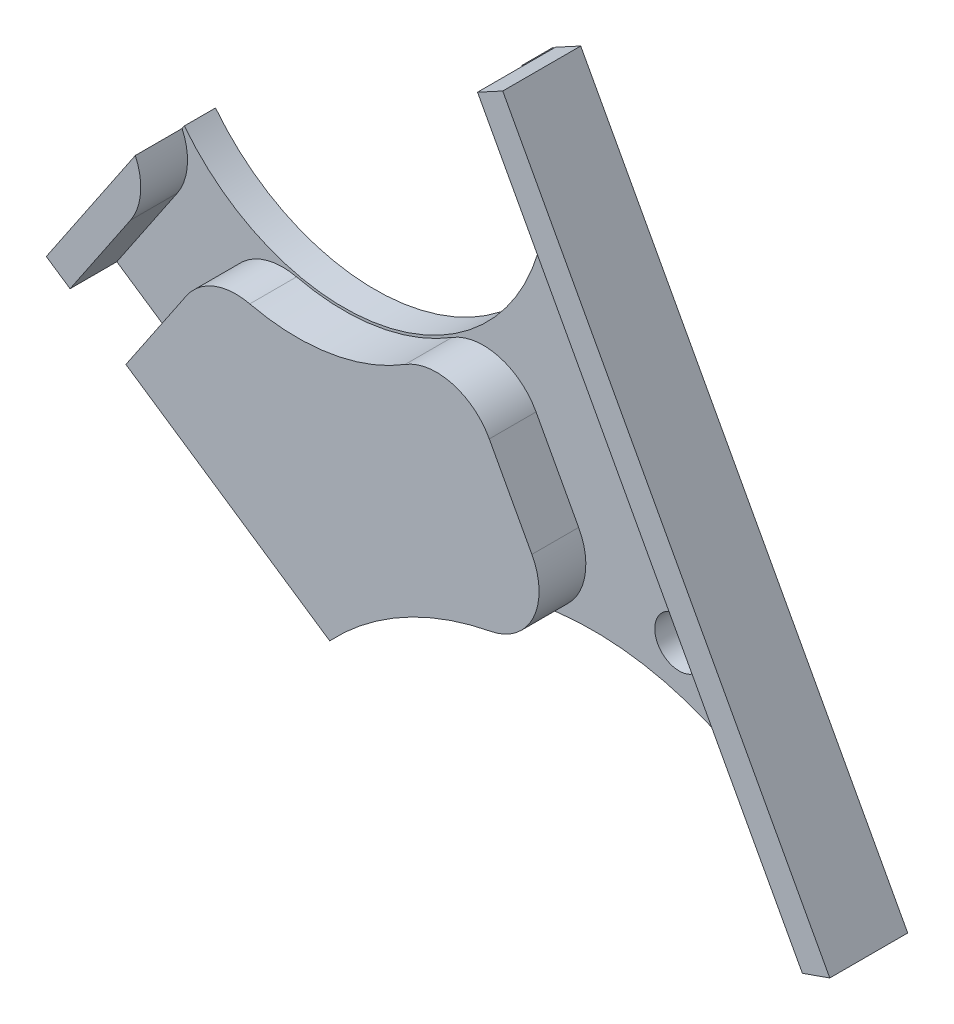
ISO-10303-21;
HEADER;
FILE_DESCRIPTION(('STEP AP214'),'2;1');
FILE_NAME('part.step','',(''),(''),'','','');
FILE_SCHEMA(('AUTOMOTIVE_DESIGN { 1 0 10303 214 1 1 1 1 }'));
ENDSEC;
DATA;
#1=APPLICATION_CONTEXT('core data for automotive mechanical design processes');
#2=APPLICATION_PROTOCOL_DEFINITION('international standard','automotive_design',2000,#1);
#3=PRODUCT_CONTEXT('',#1,'mechanical');
#4=PRODUCT('Part','Part','',(#3));
#5=PRODUCT_RELATED_PRODUCT_CATEGORY('part','',(#4));
#6=PRODUCT_DEFINITION_FORMATION('','',#4);
#7=PRODUCT_DEFINITION_CONTEXT('part definition',#1,'design');
#8=PRODUCT_DEFINITION('design','',#6,#7);
#9=PRODUCT_DEFINITION_SHAPE('','',#8);
#10=(LENGTH_UNIT() NAMED_UNIT(*) SI_UNIT(.MILLI.,.METRE.));
#11=(NAMED_UNIT(*) PLANE_ANGLE_UNIT() SI_UNIT($,.RADIAN.));
#12=(NAMED_UNIT(*) SI_UNIT($,.STERADIAN.) SOLID_ANGLE_UNIT());
#13=UNCERTAINTY_MEASURE_WITH_UNIT(LENGTH_MEASURE(1.E-05),#10,'distance_accuracy_value','');
#14=(GEOMETRIC_REPRESENTATION_CONTEXT(3) GLOBAL_UNCERTAINTY_ASSIGNED_CONTEXT((#13)) GLOBAL_UNIT_ASSIGNED_CONTEXT((#10,
#11,#12)) REPRESENTATION_CONTEXT('',''));
#15=CARTESIAN_POINT('',(0.,0.,0.));
#16=DIRECTION('',(0.,0.,1.));
#17=DIRECTION('',(1.,0.,0.));
#18=AXIS2_PLACEMENT_3D('',#15,#16,#17);
#19=CARTESIAN_POINT('',(592.825113660689,443.6785419672,1.5875));
#20=DIRECTION('',(0.,0.,-1.));
#21=DIRECTION('',(-1.,0.,0.));
#22=AXIS2_PLACEMENT_3D('',#19,#20,#21);
#23=CYLINDRICAL_SURFACE('',#22,20.6375);
#24=CARTESIAN_POINT('',(592.825113660689,443.6785419672,-1.5875));
#25=DIRECTION('',(0.,0.,1.));
#26=DIRECTION('',(1.,0.,0.));
#27=AXIS2_PLACEMENT_3D('',#24,#25,#26);
#28=CIRCLE('',#27,20.6375);
#29=CARTESIAN_POINT('',(576.580250753386,430.950194259311,-1.5875));
#30=VERTEX_POINT('',#29);
#31=CARTESIAN_POINT('',(610.977682891891,453.496415288669,-1.5875));
#32=VERTEX_POINT('',#31);
#33=EDGE_CURVE('E380',#30,#32,#28,.T.);
#34=ORIENTED_EDGE('',*,*,#33,.F.);
#35=DIRECTION('',(0.,0.,-1.));
#36=VECTOR('',#35,1.);
#37=CARTESIAN_POINT('',(576.580250753386,430.950194259311,1.5875));
#38=LINE('',#37,#36);
#39=CARTESIAN_POINT('',(576.580250753386,430.950194259311,1.5875));
#40=VERTEX_POINT('',#39);
#41=EDGE_CURVE('E467',#40,#30,#38,.T.);
#42=ORIENTED_EDGE('',*,*,#41,.F.);
#43=CARTESIAN_POINT('',(592.825113660689,443.6785419672,1.5875));
#44=DIRECTION('',(0.,0.,1.));
#45=DIRECTION('',(1.,0.,0.));
#46=AXIS2_PLACEMENT_3D('',#43,#44,#45);
#47=CIRCLE('',#46,20.6375);
#48=CARTESIAN_POINT('',(610.977682891891,453.496415288669,1.5875));
#49=VERTEX_POINT('',#48);
#50=EDGE_CURVE('E381',#40,#49,#47,.T.);
#51=ORIENTED_EDGE('',*,*,#50,.T.);
#52=DIRECTION('',(0.,0.,-1.));
#53=VECTOR('',#52,1.);
#54=CARTESIAN_POINT('',(610.977682891891,453.496415288669,1.5875));
#55=LINE('',#54,#53);
#56=EDGE_CURVE('E136',#49,#32,#55,.T.);
#57=ORIENTED_EDGE('',*,*,#56,.T.);
#58=EDGE_LOOP('',(#34,#42,#51,#57));
#59=FACE_BOUND('',#58,.T.);
#60=ADVANCED_FACE('F119',(#59),#23,.F.);
#61=CARTESIAN_POINT('',(196.500476039685,-132.541244652355,1.5875));
#62=DIRECTION('',(-0.82903757255505,0.559192903470735,0.));
#63=DIRECTION('',(-0.559192903470735,-0.82903757255505,0.));
#64=AXIS2_PLACEMENT_3D('',#61,#62,#63);
#65=PLANE('',#64);
#66=DIRECTION('',(0.,0.,-1.));
#67=VECTOR('',#66,1.);
#68=CARTESIAN_POINT('',(576.350679015296,430.609840160944,6.35));
#69=LINE('',#68,#67);
#70=CARTESIAN_POINT('',(576.350679015296,430.609840160944,6.35));
#71=VERTEX_POINT('',#70);
#72=CARTESIAN_POINT('',(576.350679015296,430.609840160944,1.5875));
#73=VERTEX_POINT('',#72);
#74=EDGE_CURVE('E318',#71,#73,#69,.T.);
#75=ORIENTED_EDGE('',*,*,#74,.T.);
#76=DIRECTION('',(0.559192903470735,0.82903757255505,0.));
#77=VECTOR('',#76,1.);
#78=CARTESIAN_POINT('',(196.500476039685,-132.541244652355,1.5875));
#79=LINE('',#78,#77);
#80=EDGE_CURVE('E177',#73,#40,#79,.T.);
#81=ORIENTED_EDGE('',*,*,#80,.T.);
#82=ORIENTED_EDGE('',*,*,#41,.T.);
#83=DIRECTION('',(0.559192903470735,0.82903757255505,0.));
#84=VECTOR('',#83,1.);
#85=CARTESIAN_POINT('',(196.500476039685,-132.541244652355,-1.5875));
#86=LINE('',#85,#84);
#87=CARTESIAN_POINT('',(567.283779016713,417.167608117638,-1.5875));
#88=VERTEX_POINT('',#87);
#89=EDGE_CURVE('E411',#88,#30,#86,.T.);
#90=ORIENTED_EDGE('',*,*,#89,.F.);
#91=DIRECTION('',(0.,0.,-1.));
#92=VECTOR('',#91,1.);
#93=CARTESIAN_POINT('',(567.283779016713,417.167608117638,1.5875));
#94=LINE('',#93,#92);
#95=CARTESIAN_POINT('',(567.283779016713,417.167608117638,6.35));
#96=VERTEX_POINT('',#95);
#97=EDGE_CURVE('E464',#96,#88,#94,.T.);
#98=ORIENTED_EDGE('',*,*,#97,.F.);
#99=DIRECTION('',(0.559192903470735,0.82903757255505,0.));
#100=VECTOR('',#99,1.);
#101=CARTESIAN_POINT('',(196.500476039685,-132.541244652355,6.35));
#102=LINE('',#101,#100);
#103=EDGE_CURVE('E307',#96,#71,#102,.T.);
#104=ORIENTED_EDGE('',*,*,#103,.T.);
#105=EDGE_LOOP('',(#75,#81,#82,#90,#98,#104));
#106=FACE_BOUND('',#105,.T.);
#107=ADVANCED_FACE('F512',(#106),#65,.T.);
#108=CARTESIAN_POINT('',(370.783302977037,549.70885276999,1.5875));
#109=DIRECTION('',(-0.559192903470746,-0.829037572555042,0.));
#110=DIRECTION('',(0.829037572555042,-0.559192903470746,0.));
#111=AXIS2_PLACEMENT_3D('',#108,#109,#110);
#112=PLANE('',#111);
#113=DIRECTION('',(-0.829037572555042,0.559192903470746,0.));
#114=VECTOR('',#113,1.);
#115=CARTESIAN_POINT('',(370.783302977037,549.70885276999,1.5875));
#116=LINE('',#115,#114);
#117=CARTESIAN_POINT('',(575.390937438729,411.699260714598,1.5875));
#118=VERTEX_POINT('',#117);
#119=CARTESIAN_POINT('',(569.705397766147,415.5342056466,1.5875));
#120=VERTEX_POINT('',#119);
#121=EDGE_CURVE('E387',#118,#120,#116,.T.);
#122=ORIENTED_EDGE('',*,*,#121,.T.);
#123=DIRECTION('',(0.,0.,-1.));
#124=VECTOR('',#123,1.);
#125=CARTESIAN_POINT('',(569.705397766147,415.5342056466,6.35));
#126=LINE('',#125,#124);
#127=CARTESIAN_POINT('',(569.705397766147,415.5342056466,6.35));
#128=VERTEX_POINT('',#127);
#129=EDGE_CURVE('E315',#128,#120,#126,.T.);
#130=ORIENTED_EDGE('',*,*,#129,.F.);
#131=DIRECTION('',(-0.829037572555042,0.559192903470746,0.));
#132=VECTOR('',#131,1.);
#133=CARTESIAN_POINT('',(370.783302977037,549.70885276999,6.35));
#134=LINE('',#133,#132);
#135=EDGE_CURVE('E311',#128,#96,#134,.T.);
#136=ORIENTED_EDGE('',*,*,#135,.T.);
#137=ORIENTED_EDGE('',*,*,#97,.T.);
#138=DIRECTION('',(-0.829037572555042,0.559192903470746,0.));
#139=VECTOR('',#138,1.);
#140=CARTESIAN_POINT('',(370.783302977037,549.70885276999,-1.5875));
#141=LINE('',#140,#139);
#142=CARTESIAN_POINT('',(596.147549096024,397.698749370961,-1.5875));
#143=VERTEX_POINT('',#142);
#144=EDGE_CURVE('E415',#143,#88,#141,.T.);
#145=ORIENTED_EDGE('',*,*,#144,.F.);
#146=DIRECTION('',(0.,0.,-1.));
#147=VECTOR('',#146,1.);
#148=CARTESIAN_POINT('',(596.147549096024,397.698749370961,1.5875));
#149=LINE('',#148,#147);
#150=CARTESIAN_POINT('',(596.147549096024,397.698749370961,6.35));
#151=VERTEX_POINT('',#150);
#152=EDGE_CURVE('E461',#151,#143,#149,.T.);
#153=ORIENTED_EDGE('',*,*,#152,.F.);
#154=DIRECTION('',(-0.829037572555042,0.559192903470746,0.));
#155=VECTOR('',#154,1.);
#156=CARTESIAN_POINT('',(370.783302977037,549.70885276999,6.35));
#157=LINE('',#156,#155);
#158=CARTESIAN_POINT('',(575.390937438729,411.699260714598,6.35));
#159=VERTEX_POINT('',#158);
#160=EDGE_CURVE('E345',#151,#159,#157,.T.);
#161=ORIENTED_EDGE('',*,*,#160,.T.);
#162=DIRECTION('',(0.,0.,-1.));
#163=VECTOR('',#162,1.);
#164=CARTESIAN_POINT('',(575.390937438729,411.699260714598,6.35));
#165=LINE('',#164,#163);
#166=EDGE_CURVE('E356',#159,#118,#165,.T.);
#167=ORIENTED_EDGE('',*,*,#166,.T.);
#168=EDGE_LOOP('',(#122,#130,#136,#137,#145,#153,#161,#167));
#169=FACE_BOUND('',#168,.T.);
#170=ADVANCED_FACE('F520',(#169),#112,.T.);
#171=CARTESIAN_POINT('',(618.232675614043,377.021426060275,1.5875));
#172=DIRECTION('',(0.,0.,-1.));
#173=DIRECTION('',(-1.,0.,0.));
#174=AXIS2_PLACEMENT_3D('',#171,#172,#173);
#175=CYLINDRICAL_SURFACE('',#174,30.2539999440006);
#176=CARTESIAN_POINT('',(618.232675614043,377.021426060275,1.5875));
#177=DIRECTION('',(0.,0.,1.));
#178=DIRECTION('',(1.,0.,0.));
#179=AXIS2_PLACEMENT_3D('',#176,#177,#178);
#180=CIRCLE('',#179,30.2539999440006);
#181=CARTESIAN_POINT('',(644.263601134856,392.438800322498,1.5875));
#182=VERTEX_POINT('',#181);
#183=CARTESIAN_POINT('',(612.524795422006,406.732107915879,1.5875));
#184=VERTEX_POINT('',#183);
#185=EDGE_CURVE('E391',#182,#184,#180,.T.);
#186=ORIENTED_EDGE('',*,*,#185,.T.);
#187=DIRECTION('',(0.,0.,-1.));
#188=VECTOR('',#187,1.);
#189=CARTESIAN_POINT('',(612.524795422006,406.732107915879,6.35));
#190=LINE('',#189,#188);
#191=CARTESIAN_POINT('',(612.524795422006,406.732107915879,6.35));
#192=VERTEX_POINT('',#191);
#193=EDGE_CURVE('E353',#192,#184,#190,.T.);
#194=ORIENTED_EDGE('',*,*,#193,.F.);
#195=CARTESIAN_POINT('',(618.232675614043,377.021426060275,6.35));
#196=DIRECTION('',(0.,0.,1.));
#197=DIRECTION('',(1.,0.,0.));
#198=AXIS2_PLACEMENT_3D('',#195,#196,#197);
#199=CIRCLE('',#198,30.2539999440006);
#200=EDGE_CURVE('E349',#192,#151,#199,.T.);
#201=ORIENTED_EDGE('',*,*,#200,.T.);
#202=ORIENTED_EDGE('',*,*,#152,.T.);
#203=CARTESIAN_POINT('',(618.232675614043,377.021426060275,-1.5875));
#204=DIRECTION('',(0.,0.,1.));
#205=DIRECTION('',(1.,0.,0.));
#206=AXIS2_PLACEMENT_3D('',#203,#204,#205);
#207=CIRCLE('',#206,30.2539999440006);
#208=CARTESIAN_POINT('',(644.263601134856,392.438800322498,-1.5875));
#209=VERTEX_POINT('',#208);
#210=EDGE_CURVE('E419',#209,#143,#207,.T.);
#211=ORIENTED_EDGE('',*,*,#210,.F.);
#212=DIRECTION('',(0.,0.,-1.));
#213=VECTOR('',#212,1.);
#214=CARTESIAN_POINT('',(644.263601134856,392.438800322498,1.5875));
#215=LINE('',#214,#213);
#216=EDGE_CURVE('E458',#182,#209,#215,.T.);
#217=ORIENTED_EDGE('',*,*,#216,.F.);
#218=EDGE_LOOP('',(#186,#194,#201,#202,#211,#217));
#219=FACE_BOUND('',#218,.T.);
#220=ADVANCED_FACE('F542',(#219),#175,.F.);
#221=CARTESIAN_POINT('',(-51.8861243691058,147.418357522562,1.5875));
#222=DIRECTION('',(0.332001308771841,-0.943278925331094,0.));
#223=DIRECTION('',(0.943278925331095,0.332001308771841,0.));
#224=AXIS2_PLACEMENT_3D('',#221,#222,#223);
#225=PLANE('',#224);
#226=DIRECTION('',(0.,0.,-1.));
#227=VECTOR('',#226,1.);
#228=CARTESIAN_POINT('',(644.285487293963,392.446503487779,6.35));
#229=LINE('',#228,#227);
#230=CARTESIAN_POINT('',(644.285487293963,392.446503487779,6.35));
#231=VERTEX_POINT('',#230);
#232=CARTESIAN_POINT('',(644.285487293963,392.446503487779,1.5875));
#233=VERTEX_POINT('',#232);
#234=EDGE_CURVE('E265',#231,#233,#229,.T.);
#235=ORIENTED_EDGE('',*,*,#234,.T.);
#236=DIRECTION('',(-0.943278925331095,-0.332001308771841,0.));
#237=VECTOR('',#236,1.);
#238=CARTESIAN_POINT('',(-51.8861243691058,147.418357522562,1.5875));
#239=LINE('',#238,#237);
#240=EDGE_CURVE('E395',#233,#182,#239,.T.);
#241=ORIENTED_EDGE('',*,*,#240,.T.);
#242=ORIENTED_EDGE('',*,*,#216,.T.);
#243=DIRECTION('',(-0.943278925331095,-0.332001308771841,0.));
#244=VECTOR('',#243,1.);
#245=CARTESIAN_POINT('',(-51.8861243691058,147.418357522562,-1.5875));
#246=LINE('',#245,#244);
#247=CARTESIAN_POINT('',(647.075278433135,393.42841274551,-1.5875));
#248=VERTEX_POINT('',#247);
#249=EDGE_CURVE('E423',#248,#209,#246,.T.);
#250=ORIENTED_EDGE('',*,*,#249,.F.);
#251=DIRECTION('',(0.,0.,-1.));
#252=VECTOR('',#251,1.);
#253=CARTESIAN_POINT('',(647.075278433135,393.42841274551,1.5875));
#254=LINE('',#253,#252);
#255=CARTESIAN_POINT('',(647.075278433135,393.42841274551,6.35));
#256=VERTEX_POINT('',#255);
#257=EDGE_CURVE('E290',#256,#248,#254,.T.);
#258=ORIENTED_EDGE('',*,*,#257,.F.);
#259=DIRECTION('',(-0.943278925331095,-0.332001308771841,0.));
#260=VECTOR('',#259,1.);
#261=CARTESIAN_POINT('',(-51.8861243691058,147.418357522562,6.35));
#262=LINE('',#261,#260);
#263=EDGE_CURVE('E282',#256,#231,#262,.T.);
#264=ORIENTED_EDGE('',*,*,#263,.T.);
#265=EDGE_LOOP('',(#235,#241,#242,#250,#258,#264));
#266=FACE_BOUND('',#265,.T.);
#267=ADVANCED_FACE('F288',(#266),#225,.T.);
#268=CARTESIAN_POINT('',(665.259241269681,359.807522204356,1.5875));
#269=DIRECTION('',(0.879591483038276,0.475729779356438,0.));
#270=DIRECTION('',(-0.475729779356438,0.879591483038277,0.));
#271=AXIS2_PLACEMENT_3D('',#268,#269,#270);
#272=PLANE('',#271);
#273=ORIENTED_EDGE('',*,*,#257,.T.);
#274=DIRECTION('',(0.475729779356438,-0.879591483038277,0.));
#275=VECTOR('',#274,1.);
#276=CARTESIAN_POINT('',(665.259241269681,359.807522204356,-1.5875));
#277=LINE('',#276,#275);
#278=CARTESIAN_POINT('',(613.770385850538,455.006857338125,-1.5875));
#279=VERTEX_POINT('',#278);
#280=EDGE_CURVE('E427',#279,#248,#277,.T.);
#281=ORIENTED_EDGE('',*,*,#280,.F.);
#282=DIRECTION('',(0.,0.,-1.));
#283=VECTOR('',#282,1.);
#284=CARTESIAN_POINT('',(613.770385850538,455.006857338125,1.5875));
#285=LINE('',#284,#283);
#286=CARTESIAN_POINT('',(613.770385850538,455.006857338125,6.35));
#287=VERTEX_POINT('',#286);
#288=EDGE_CURVE('E453',#287,#279,#285,.T.);
#289=ORIENTED_EDGE('',*,*,#288,.F.);
#290=DIRECTION('',(0.475729779356438,-0.879591483038277,0.));
#291=VECTOR('',#290,1.);
#292=CARTESIAN_POINT('',(665.259241269681,359.807522204356,6.35));
#293=LINE('',#292,#291);
#294=EDGE_CURVE('E292',#287,#256,#293,.T.);
#295=ORIENTED_EDGE('',*,*,#294,.T.);
#296=EDGE_LOOP('',(#273,#281,#289,#295));
#297=FACE_BOUND('',#296,.T.);
#298=ADVANCED_FACE('F550',(#297),#272,.T.);
#299=CARTESIAN_POINT('',(-51.4888554191417,95.1993351337647,1.5875));
#300=DIRECTION('',(-0.475729779356444,0.879591483038273,0.));
#301=DIRECTION('',(-0.879591483038273,-0.475729779356444,0.));
#302=AXIS2_PLACEMENT_3D('',#299,#300,#301);
#303=PLANE('',#302);
#304=ORIENTED_EDGE('',*,*,#288,.T.);
#305=DIRECTION('',(0.879591483038274,0.475729779356444,0.));
#306=VECTOR('',#305,1.);
#307=CARTESIAN_POINT('',(-51.4888554191417,95.1993351337647,-1.5875));
#308=LINE('',#307,#306);
#309=CARTESIAN_POINT('',(611.201099128583,453.617250652625,-1.5875));
#310=VERTEX_POINT('',#309);
#311=EDGE_CURVE('E431',#310,#279,#308,.T.);
#312=ORIENTED_EDGE('',*,*,#311,.F.);
#313=DIRECTION('',(0.,0.,-1.));
#314=VECTOR('',#313,1.);
#315=CARTESIAN_POINT('',(611.201099128583,453.617250652625,1.5875));
#316=LINE('',#315,#314);
#317=CARTESIAN_POINT('',(611.201099128583,453.617250652625,1.5875));
#318=VERTEX_POINT('',#317);
#319=EDGE_CURVE('E450',#318,#310,#316,.T.);
#320=ORIENTED_EDGE('',*,*,#319,.F.);
#321=DIRECTION('',(0.,0.,-1.));
#322=VECTOR('',#321,1.);
#323=CARTESIAN_POINT('',(611.201099128583,453.617250652625,6.35));
#324=LINE('',#323,#322);
#325=CARTESIAN_POINT('',(611.201099128583,453.617250652625,6.35));
#326=VERTEX_POINT('',#325);
#327=EDGE_CURVE('E276',#326,#318,#324,.T.);
#328=ORIENTED_EDGE('',*,*,#327,.F.);
#329=DIRECTION('',(0.879591483038274,0.475729779356444,0.));
#330=VECTOR('',#329,1.);
#331=CARTESIAN_POINT('',(-51.4888554191417,95.1993351337647,6.35));
#332=LINE('',#331,#330);
#333=EDGE_CURVE('E285',#326,#287,#332,.T.);
#334=ORIENTED_EDGE('',*,*,#333,.T.);
#335=EDGE_LOOP('',(#304,#312,#320,#328,#334));
#336=FACE_BOUND('',#335,.T.);
#337=ADVANCED_FACE('F553',(#336),#303,.T.);
#338=CARTESIAN_POINT('',(592.825113660689,443.6785419672,1.5875));
#339=DIRECTION('',(0.,0.,-1.));
#340=DIRECTION('',(-1.,0.,0.));
#341=AXIS2_PLACEMENT_3D('',#338,#339,#340);
#342=CYLINDRICAL_SURFACE('',#341,20.8915);
#343=CARTESIAN_POINT('',(592.825113660689,443.6785419672,-1.5875));
#344=DIRECTION('',(0.,0.,1.));
#345=DIRECTION('',(1.,0.,0.));
#346=AXIS2_PLACEMENT_3D('',#343,#344,#345);
#347=CIRCLE('',#346,20.8915);
#348=CARTESIAN_POINT('',(612.522769872401,450.639656246912,-1.5875));
#349=VERTEX_POINT('',#348);
#350=EDGE_CURVE('E435',#349,#310,#347,.T.);
#351=ORIENTED_EDGE('',*,*,#350,.F.);
#352=DIRECTION('',(0.,0.,-1.));
#353=VECTOR('',#352,1.);
#354=CARTESIAN_POINT('',(612.522769872401,450.639656246912,1.5875));
#355=LINE('',#354,#353);
#356=CARTESIAN_POINT('',(612.522769872401,450.639656246912,1.5875));
#357=VERTEX_POINT('',#356);
#358=EDGE_CURVE('E166',#357,#349,#355,.T.);
#359=ORIENTED_EDGE('',*,*,#358,.F.);
#360=CARTESIAN_POINT('',(592.825113660689,443.6785419672,1.5875));
#361=DIRECTION('',(0.,0.,1.));
#362=DIRECTION('',(1.,0.,0.));
#363=AXIS2_PLACEMENT_3D('',#360,#361,#362);
#364=CIRCLE('',#363,20.8915);
#365=EDGE_CURVE('E398',#357,#318,#364,.T.);
#366=ORIENTED_EDGE('',*,*,#365,.T.);
#367=ORIENTED_EDGE('',*,*,#319,.T.);
#368=EDGE_LOOP('',(#351,#359,#366,#367));
#369=FACE_BOUND('',#368,.T.);
#370=ADVANCED_FACE('F557',(#369),#342,.F.);
#371=CARTESIAN_POINT('',(662.466538311035,358.297080154899,1.5875));
#372=DIRECTION('',(0.879591483038276,0.475729779356438,0.));
#373=DIRECTION('',(-0.475729779356438,0.879591483038277,0.));
#374=AXIS2_PLACEMENT_3D('',#371,#372,#373);
#375=PLANE('',#374);
#376=DIRECTION('',(0.475729779356438,-0.879591483038277,0.));
#377=VECTOR('',#376,1.);
#378=CARTESIAN_POINT('',(662.466538311035,358.297080154899,-1.5875));
#379=LINE('',#378,#377);
#380=EDGE_CURVE('E439',#32,#349,#379,.T.);
#381=ORIENTED_EDGE('',*,*,#380,.F.);
#382=ORIENTED_EDGE('',*,*,#56,.F.);
#383=DIRECTION('',(0.475729779356438,-0.879591483038277,0.));
#384=VECTOR('',#383,1.);
#385=CARTESIAN_POINT('',(662.466538311035,358.297080154899,1.5875));
#386=LINE('',#385,#384);
#387=EDGE_CURVE('E402',#49,#357,#386,.T.);
#388=ORIENTED_EDGE('',*,*,#387,.T.);
#389=ORIENTED_EDGE('',*,*,#358,.T.);
#390=EDGE_LOOP('',(#381,#382,#388,#389));
#391=FACE_BOUND('',#390,.T.);
#392=ADVANCED_FACE('F561',(#391),#375,.T.);
#393=CARTESIAN_POINT('',(626.978202996506,410.564645837888,1.5875));
#394=DIRECTION('',(0.,0.,-1.));
#395=DIRECTION('',(-1.,0.,0.));
#396=AXIS2_PLACEMENT_3D('',#393,#394,#395);
#397=CYLINDRICAL_SURFACE('',#396,2.48919999999995);
#398=CARTESIAN_POINT('',(626.978202996506,410.564645837888,1.5875));
#399=DIRECTION('',(0.,0.,1.));
#400=DIRECTION('',(1.,0.,0.));
#401=AXIS2_PLACEMENT_3D('',#398,#399,#400);
#402=CIRCLE('',#401,2.48919999999995);
#403=CARTESIAN_POINT('',(629.467402996506,410.564645837888,1.5875));
#404=VERTEX_POINT('',#403);
#405=EDGE_CURVE('E405',#404,#404,#402,.T.);
#406=ORIENTED_EDGE('',*,*,#405,.T.);
#407=EDGE_LOOP('',(#406));
#408=FACE_BOUND('',#407,.T.);
#409=CARTESIAN_POINT('',(626.978202996506,410.564645837888,-1.5875));
#410=DIRECTION('',(0.,0.,1.));
#411=DIRECTION('',(1.,0.,0.));
#412=AXIS2_PLACEMENT_3D('',#409,#410,#411);
#413=CIRCLE('',#412,2.48919999999995);
#414=CARTESIAN_POINT('',(629.467402996506,410.564645837888,-1.5875));
#415=VERTEX_POINT('',#414);
#416=EDGE_CURVE('E384',#415,#415,#413,.T.);
#417=ORIENTED_EDGE('',*,*,#416,.F.);
#418=EDGE_LOOP('',(#417));
#419=FACE_BOUND('',#418,.T.);
#420=ADVANCED_FACE('F564',(#408,#419),#397,.F.);
#421=CARTESIAN_POINT('',(0.,0.,1.5875));
#422=DIRECTION('',(0.,0.,1.));
#423=DIRECTION('',(1.,0.,0.));
#424=AXIS2_PLACEMENT_3D('',#421,#422,#423);
#425=PLANE('',#424);
#426=DIRECTION('',(0.475729779356438,-0.879591483038277,0.));
#427=VECTOR('',#426,1.);
#428=CARTESIAN_POINT('',(662.689954547727,358.417915518856,1.5875));
#429=LINE('',#428,#427);
#430=EDGE_CURVE('E12',#318,#233,#429,.T.);
#431=ORIENTED_EDGE('',*,*,#430,.F.);
#432=ORIENTED_EDGE('',*,*,#365,.F.);
#433=ORIENTED_EDGE('',*,*,#387,.F.);
#434=ORIENTED_EDGE('',*,*,#50,.F.);
#435=ORIENTED_EDGE('',*,*,#80,.F.);
#436=CARTESIAN_POINT('',(570.808499923693,428.071047747886,1.5875));
#437=DIRECTION('',(0.,0.,1.));
#438=DIRECTION('',(1.,0.,0.));
#439=AXIS2_PLACEMENT_3D('',#436,#437,#438);
#440=CIRCLE('',#439,6.09599999999994);
#441=CARTESIAN_POINT('',(575.862312965989,424.662207808329,1.5875));
#442=VERTEX_POINT('',#441);
#443=EDGE_CURVE('E492',#73,#442,#440,.F.);
#444=ORIENTED_EDGE('',*,*,#443,.T.);
#445=DIRECTION('',(0.559192903470747,0.829037572555042,0.));
#446=VECTOR('',#445,1.);
#447=CARTESIAN_POINT('',(198.922094789109,-134.17464712339,1.5875));
#448=LINE('',#447,#446);
#449=EDGE_CURVE('E128',#120,#442,#448,.T.);
#450=ORIENTED_EDGE('',*,*,#449,.F.);
#451=ORIENTED_EDGE('',*,*,#121,.F.);
#452=DIRECTION('',(0.559192903470747,0.829037572555042,0.));
#453=VECTOR('',#452,1.);
#454=CARTESIAN_POINT('',(204.607634461691,-138.009592055393,1.5875));
#455=LINE('',#454,#453);
#456=CARTESIAN_POINT('',(581.547852638571,420.827262876326,1.5875));
#457=VERTEX_POINT('',#456);
#458=EDGE_CURVE('E470',#118,#457,#455,.T.);
#459=ORIENTED_EDGE('',*,*,#458,.T.);
#460=CARTESIAN_POINT('',(586.601665680867,417.418422936768,1.5875));
#461=DIRECTION('',(0.,0.,1.));
#462=DIRECTION('',(1.,0.,0.));
#463=AXIS2_PLACEMENT_3D('',#460,#461,#462);
#464=CIRCLE('',#463,6.09600000000007);
#465=CARTESIAN_POINT('',(588.007432753956,423.350120411878,1.5875));
#466=VERTEX_POINT('',#465);
#467=EDGE_CURVE('E474',#457,#466,#464,.F.);
#468=ORIENTED_EDGE('',*,*,#467,.T.);
#469=CARTESIAN_POINT('',(592.825113660689,443.6785419672,1.5875));
#470=DIRECTION('',(0.,0.,1.));
#471=DIRECTION('',(1.,0.,0.));
#472=AXIS2_PLACEMENT_3D('',#469,#470,#471);
#473=CIRCLE('',#472,20.8915);
#474=CARTESIAN_POINT('',(603.827552769673,425.919006334107,1.5875));
#475=VERTEX_POINT('',#474);
#476=EDGE_CURVE('E478',#475,#466,#473,.F.);
#477=ORIENTED_EDGE('',*,*,#476,.F.);
#478=CARTESIAN_POINT('',(607.037990929134,420.736892593144,1.5875));
#479=DIRECTION('',(0.,0.,1.));
#480=DIRECTION('',(1.,0.,0.));
#481=AXIS2_PLACEMENT_3D('',#478,#479,#480);
#482=CIRCLE('',#481,6.09600000000001);
#483=CARTESIAN_POINT('',(612.399980609735,423.636941328101,1.5875));
#484=VERTEX_POINT('',#483);
#485=EDGE_CURVE('E481',#475,#484,#482,.F.);
#486=ORIENTED_EDGE('',*,*,#485,.T.);
#487=DIRECTION('',(0.475729779356439,-0.879591483038276,0.));
#488=VECTOR('',#487,1.);
#489=CARTESIAN_POINT('',(651.072310239757,352.134476593116,1.5875));
#490=LINE('',#489,#488);
#491=CARTESIAN_POINT('',(616.736681390203,415.618681306319,1.5875));
#492=VERTEX_POINT('',#491);
#493=EDGE_CURVE('E485',#484,#492,#490,.T.);
#494=ORIENTED_EDGE('',*,*,#493,.T.);
#495=CARTESIAN_POINT('',(611.374691709602,412.718632571362,1.5875));
#496=DIRECTION('',(0.,0.,1.));
#497=DIRECTION('',(1.,0.,0.));
#498=AXIS2_PLACEMENT_3D('',#495,#496,#497);
#499=CIRCLE('',#498,6.09599999999998);
#500=EDGE_CURVE('E489',#184,#492,#499,.T.);
#501=ORIENTED_EDGE('',*,*,#500,.F.);
#502=ORIENTED_EDGE('',*,*,#185,.F.);
#503=ORIENTED_EDGE('',*,*,#240,.F.);
#504=EDGE_LOOP('',(#431,#432,#433,#434,#435,#444,#450,#451,#459,#468,#477,#486,#494,#501,#502,#503));
#505=FACE_BOUND('',#504,.T.);
#506=ORIENTED_EDGE('',*,*,#405,.F.);
#507=EDGE_LOOP('',(#506));
#508=FACE_BOUND('',#507,.T.);
#509=ADVANCED_FACE('F506',(#505,#508),#425,.T.);
#510=CARTESIAN_POINT('',(0.,0.,-1.5875));
#511=DIRECTION('',(0.,0.,1.));
#512=DIRECTION('',(1.,0.,0.));
#513=AXIS2_PLACEMENT_3D('',#510,#511,#512);
#514=PLANE('',#513);
#515=ORIENTED_EDGE('',*,*,#33,.T.);
#516=ORIENTED_EDGE('',*,*,#380,.T.);
#517=ORIENTED_EDGE('',*,*,#350,.T.);
#518=ORIENTED_EDGE('',*,*,#311,.T.);
#519=ORIENTED_EDGE('',*,*,#280,.T.);
#520=ORIENTED_EDGE('',*,*,#249,.T.);
#521=ORIENTED_EDGE('',*,*,#210,.T.);
#522=ORIENTED_EDGE('',*,*,#144,.T.);
#523=ORIENTED_EDGE('',*,*,#89,.T.);
#524=EDGE_LOOP('',(#515,#516,#517,#518,#519,#520,#521,#522,#523));
#525=FACE_BOUND('',#524,.T.);
#526=ORIENTED_EDGE('',*,*,#416,.T.);
#527=EDGE_LOOP('',(#526));
#528=FACE_BOUND('',#527,.T.);
#529=ADVANCED_FACE('F516',(#525,#528),#514,.F.);
#530=CARTESIAN_POINT('',(611.374691709602,412.718632571362,6.35));
#531=DIRECTION('',(0.,0.,-1.));
#532=DIRECTION('',(-1.,0.,0.));
#533=AXIS2_PLACEMENT_3D('',#530,#531,#532);
#534=CYLINDRICAL_SURFACE('',#533,6.09599999999998);
#535=ORIENTED_EDGE('',*,*,#193,.T.);
#536=ORIENTED_EDGE('',*,*,#500,.T.);
#537=DIRECTION('',(0.,0.,-1.));
#538=VECTOR('',#537,1.);
#539=CARTESIAN_POINT('',(616.736681390203,415.618681306319,6.35));
#540=LINE('',#539,#538);
#541=CARTESIAN_POINT('',(616.736681390203,415.618681306319,6.35));
#542=VERTEX_POINT('',#541);
#543=EDGE_CURVE('E376',#542,#492,#540,.T.);
#544=ORIENTED_EDGE('',*,*,#543,.F.);
#545=CARTESIAN_POINT('',(611.374691709602,412.718632571362,6.35));
#546=DIRECTION('',(0.,0.,1.));
#547=DIRECTION('',(1.,0.,0.));
#548=AXIS2_PLACEMENT_3D('',#545,#546,#547);
#549=CIRCLE('',#548,6.09599999999998);
#550=EDGE_CURVE('E325',#542,#192,#549,.F.);
#551=ORIENTED_EDGE('',*,*,#550,.T.);
#552=EDGE_LOOP('',(#535,#536,#544,#551));
#553=FACE_BOUND('',#552,.T.);
#554=ADVANCED_FACE('F569',(#553),#534,.T.);
#555=CARTESIAN_POINT('',(651.072310239757,352.134476593116,6.35));
#556=DIRECTION('',(-0.879591483038276,-0.475729779356439,0.));
#557=DIRECTION('',(0.475729779356439,-0.879591483038276,0.));
#558=AXIS2_PLACEMENT_3D('',#555,#556,#557);
#559=PLANE('',#558);
#560=ORIENTED_EDGE('',*,*,#493,.F.);
#561=DIRECTION('',(0.,0.,-1.));
#562=VECTOR('',#561,1.);
#563=CARTESIAN_POINT('',(612.399980609735,423.636941328101,6.35));
#564=LINE('',#563,#562);
#565=CARTESIAN_POINT('',(612.399980609735,423.636941328101,6.35));
#566=VERTEX_POINT('',#565);
#567=EDGE_CURVE('E372',#566,#484,#564,.T.);
#568=ORIENTED_EDGE('',*,*,#567,.F.);
#569=DIRECTION('',(-0.475729779356439,0.879591483038276,0.));
#570=VECTOR('',#569,1.);
#571=CARTESIAN_POINT('',(651.072310239757,352.134476593116,6.35));
#572=LINE('',#571,#570);
#573=EDGE_CURVE('E329',#542,#566,#572,.T.);
#574=ORIENTED_EDGE('',*,*,#573,.F.);
#575=ORIENTED_EDGE('',*,*,#543,.T.);
#576=EDGE_LOOP('',(#560,#568,#574,#575));
#577=FACE_BOUND('',#576,.T.);
#578=ADVANCED_FACE('F574',(#577),#559,.F.);
#579=CARTESIAN_POINT('',(607.037990929134,420.736892593144,6.35));
#580=DIRECTION('',(0.,0.,-1.));
#581=DIRECTION('',(-1.,0.,0.));
#582=AXIS2_PLACEMENT_3D('',#579,#580,#581);
#583=CYLINDRICAL_SURFACE('',#582,6.09600000000001);
#584=ORIENTED_EDGE('',*,*,#485,.F.);
#585=DIRECTION('',(0.,0.,-1.));
#586=VECTOR('',#585,1.);
#587=CARTESIAN_POINT('',(603.827552769673,425.919006334107,6.35));
#588=LINE('',#587,#586);
#589=CARTESIAN_POINT('',(603.827552769673,425.919006334107,6.35));
#590=VERTEX_POINT('',#589);
#591=EDGE_CURVE('E368',#590,#475,#588,.T.);
#592=ORIENTED_EDGE('',*,*,#591,.F.);
#593=CARTESIAN_POINT('',(607.037990929134,420.736892593144,6.35));
#594=DIRECTION('',(0.,0.,1.));
#595=DIRECTION('',(1.,0.,0.));
#596=AXIS2_PLACEMENT_3D('',#593,#594,#595);
#597=CIRCLE('',#596,6.09600000000001);
#598=EDGE_CURVE('E332',#566,#590,#597,.T.);
#599=ORIENTED_EDGE('',*,*,#598,.F.);
#600=ORIENTED_EDGE('',*,*,#567,.T.);
#601=EDGE_LOOP('',(#584,#592,#599,#600));
#602=FACE_BOUND('',#601,.T.);
#603=ADVANCED_FACE('F578',(#602),#583,.T.);
#604=CARTESIAN_POINT('',(592.825113660689,443.6785419672,6.35));
#605=DIRECTION('',(0.,0.,-1.));
#606=DIRECTION('',(-1.,0.,0.));
#607=AXIS2_PLACEMENT_3D('',#604,#605,#606);
#608=CYLINDRICAL_SURFACE('',#607,20.8915);
#609=ORIENTED_EDGE('',*,*,#591,.T.);
#610=ORIENTED_EDGE('',*,*,#476,.T.);
#611=DIRECTION('',(0.,0.,-1.));
#612=VECTOR('',#611,1.);
#613=CARTESIAN_POINT('',(588.007432753956,423.350120411878,6.35));
#614=LINE('',#613,#612);
#615=CARTESIAN_POINT('',(588.007432753956,423.350120411878,6.35));
#616=VERTEX_POINT('',#615);
#617=EDGE_CURVE('E364',#616,#466,#614,.T.);
#618=ORIENTED_EDGE('',*,*,#617,.F.);
#619=CARTESIAN_POINT('',(592.825113660689,443.6785419672,6.35));
#620=DIRECTION('',(0.,0.,1.));
#621=DIRECTION('',(1.,0.,0.));
#622=AXIS2_PLACEMENT_3D('',#619,#620,#621);
#623=CIRCLE('',#622,20.8915);
#624=EDGE_CURVE('E335',#616,#590,#623,.T.);
#625=ORIENTED_EDGE('',*,*,#624,.T.);
#626=EDGE_LOOP('',(#609,#610,#618,#625));
#627=FACE_BOUND('',#626,.T.);
#628=ADVANCED_FACE('F582',(#627),#608,.F.);
#629=CARTESIAN_POINT('',(586.601665680867,417.418422936768,6.35));
#630=DIRECTION('',(0.,0.,-1.));
#631=DIRECTION('',(-1.,0.,0.));
#632=AXIS2_PLACEMENT_3D('',#629,#630,#631);
#633=CYLINDRICAL_SURFACE('',#632,6.09600000000007);
#634=ORIENTED_EDGE('',*,*,#467,.F.);
#635=DIRECTION('',(0.,0.,-1.));
#636=VECTOR('',#635,1.);
#637=CARTESIAN_POINT('',(581.547852638571,420.827262876326,6.35));
#638=LINE('',#637,#636);
#639=CARTESIAN_POINT('',(581.547852638571,420.827262876326,6.35));
#640=VERTEX_POINT('',#639);
#641=EDGE_CURVE('E360',#640,#457,#638,.T.);
#642=ORIENTED_EDGE('',*,*,#641,.F.);
#643=CARTESIAN_POINT('',(586.601665680867,417.418422936768,6.35));
#644=DIRECTION('',(0.,0.,1.));
#645=DIRECTION('',(1.,0.,0.));
#646=AXIS2_PLACEMENT_3D('',#643,#644,#645);
#647=CIRCLE('',#646,6.09600000000007);
#648=EDGE_CURVE('E339',#616,#640,#647,.T.);
#649=ORIENTED_EDGE('',*,*,#648,.F.);
#650=ORIENTED_EDGE('',*,*,#617,.T.);
#651=EDGE_LOOP('',(#634,#642,#649,#650));
#652=FACE_BOUND('',#651,.T.);
#653=ADVANCED_FACE('F586',(#652),#633,.T.);
#654=CARTESIAN_POINT('',(204.607634461691,-138.009592055393,6.35));
#655=DIRECTION('',(0.829037572555042,-0.559192903470747,0.));
#656=DIRECTION('',(0.559192903470747,0.829037572555042,0.));
#657=AXIS2_PLACEMENT_3D('',#654,#655,#656);
#658=PLANE('',#657);
#659=ORIENTED_EDGE('',*,*,#458,.F.);
#660=ORIENTED_EDGE('',*,*,#166,.F.);
#661=DIRECTION('',(-0.559192903470747,-0.829037572555042,0.));
#662=VECTOR('',#661,1.);
#663=CARTESIAN_POINT('',(204.607634461691,-138.009592055393,6.35));
#664=LINE('',#663,#662);
#665=EDGE_CURVE('E342',#640,#159,#664,.T.);
#666=ORIENTED_EDGE('',*,*,#665,.F.);
#667=ORIENTED_EDGE('',*,*,#641,.T.);
#668=EDGE_LOOP('',(#659,#660,#666,#667));
#669=FACE_BOUND('',#668,.T.);
#670=ADVANCED_FACE('F590',(#669),#658,.F.);
#671=CARTESIAN_POINT('',(0.,0.,6.35));
#672=DIRECTION('',(0.,0.,1.));
#673=DIRECTION('',(1.,0.,0.));
#674=AXIS2_PLACEMENT_3D('',#671,#672,#673);
#675=PLANE('',#674);
#676=ORIENTED_EDGE('',*,*,#550,.F.);
#677=ORIENTED_EDGE('',*,*,#573,.T.);
#678=ORIENTED_EDGE('',*,*,#598,.T.);
#679=ORIENTED_EDGE('',*,*,#624,.F.);
#680=ORIENTED_EDGE('',*,*,#648,.T.);
#681=ORIENTED_EDGE('',*,*,#665,.T.);
#682=ORIENTED_EDGE('',*,*,#160,.F.);
#683=ORIENTED_EDGE('',*,*,#200,.F.);
#684=EDGE_LOOP('',(#676,#677,#678,#679,#680,#681,#682,#683));
#685=FACE_BOUND('',#684,.T.);
#686=ADVANCED_FACE('F594',(#685),#675,.T.);
#687=CARTESIAN_POINT('',(198.922094789109,-134.17464712339,6.35));
#688=DIRECTION('',(0.829037572555042,-0.559192903470747,0.));
#689=DIRECTION('',(0.559192903470747,0.829037572555042,0.));
#690=AXIS2_PLACEMENT_3D('',#687,#688,#689);
#691=PLANE('',#690);
#692=ORIENTED_EDGE('',*,*,#129,.T.);
#693=ORIENTED_EDGE('',*,*,#449,.T.);
#694=DIRECTION('',(0.,0.,-1.));
#695=VECTOR('',#694,1.);
#696=CARTESIAN_POINT('',(575.862312965989,424.662207808329,6.35));
#697=LINE('',#696,#695);
#698=CARTESIAN_POINT('',(575.862312965989,424.662207808329,6.35));
#699=VERTEX_POINT('',#698);
#700=EDGE_CURVE('E321',#699,#442,#697,.T.);
#701=ORIENTED_EDGE('',*,*,#700,.F.);
#702=DIRECTION('',(-0.559192903470747,-0.829037572555042,0.));
#703=VECTOR('',#702,1.);
#704=CARTESIAN_POINT('',(198.922094789109,-134.17464712339,6.35));
#705=LINE('',#704,#703);
#706=EDGE_CURVE('E275',#699,#128,#705,.T.);
#707=ORIENTED_EDGE('',*,*,#706,.T.);
#708=EDGE_LOOP('',(#692,#693,#701,#707));
#709=FACE_BOUND('',#708,.T.);
#710=ADVANCED_FACE('F498',(#709),#691,.T.);
#711=CARTESIAN_POINT('',(570.808499923693,428.071047747886,6.35));
#712=DIRECTION('',(0.,0.,-1.));
#713=DIRECTION('',(-1.,0.,0.));
#714=AXIS2_PLACEMENT_3D('',#711,#712,#713);
#715=CYLINDRICAL_SURFACE('',#714,6.09599999999994);
#716=ORIENTED_EDGE('',*,*,#443,.F.);
#717=ORIENTED_EDGE('',*,*,#74,.F.);
#718=CARTESIAN_POINT('',(570.808499923693,428.071047747886,6.35));
#719=DIRECTION('',(0.,0.,1.));
#720=DIRECTION('',(1.,0.,0.));
#721=AXIS2_PLACEMENT_3D('',#718,#719,#720);
#722=CIRCLE('',#721,6.09599999999994);
#723=EDGE_CURVE('E304',#699,#71,#722,.T.);
#724=ORIENTED_EDGE('',*,*,#723,.F.);
#725=ORIENTED_EDGE('',*,*,#700,.T.);
#726=EDGE_LOOP('',(#716,#717,#724,#725));
#727=FACE_BOUND('',#726,.T.);
#728=ADVANCED_FACE('F503',(#727),#715,.T.);
#729=CARTESIAN_POINT('',(0.,0.,6.35));
#730=DIRECTION('',(0.,0.,1.));
#731=DIRECTION('',(1.,0.,0.));
#732=AXIS2_PLACEMENT_3D('',#729,#730,#731);
#733=PLANE('',#732);
#734=ORIENTED_EDGE('',*,*,#706,.F.);
#735=ORIENTED_EDGE('',*,*,#723,.T.);
#736=ORIENTED_EDGE('',*,*,#103,.F.);
#737=ORIENTED_EDGE('',*,*,#135,.F.);
#738=EDGE_LOOP('',(#734,#735,#736,#737));
#739=FACE_BOUND('',#738,.T.);
#740=ADVANCED_FACE('F524',(#739),#733,.T.);
#741=CARTESIAN_POINT('',(662.689954547727,358.417915518856,6.35));
#742=DIRECTION('',(-0.879591483038276,-0.475729779356438,0.));
#743=DIRECTION('',(0.475729779356438,-0.879591483038277,0.));
#744=AXIS2_PLACEMENT_3D('',#741,#742,#743);
#745=PLANE('',#744);
#746=ORIENTED_EDGE('',*,*,#327,.T.);
#747=ORIENTED_EDGE('',*,*,#430,.T.);
#748=ORIENTED_EDGE('',*,*,#234,.F.);
#749=DIRECTION('',(-0.475729779356438,0.879591483038277,0.));
#750=VECTOR('',#749,1.);
#751=CARTESIAN_POINT('',(662.689954547727,358.417915518856,6.35));
#752=LINE('',#751,#750);
#753=EDGE_CURVE('E268',#231,#326,#752,.T.);
#754=ORIENTED_EDGE('',*,*,#753,.T.);
#755=EDGE_LOOP('',(#746,#747,#748,#754));
#756=FACE_BOUND('',#755,.T.);
#757=ADVANCED_FACE('F267',(#756),#745,.T.);
#758=CARTESIAN_POINT('',(0.,0.,6.35));
#759=DIRECTION('',(0.,0.,1.));
#760=DIRECTION('',(1.,0.,0.));
#761=AXIS2_PLACEMENT_3D('',#758,#759,#760);
#762=PLANE('',#761);
#763=ORIENTED_EDGE('',*,*,#753,.F.);
#764=ORIENTED_EDGE('',*,*,#263,.F.);
#765=ORIENTED_EDGE('',*,*,#294,.F.);
#766=ORIENTED_EDGE('',*,*,#333,.F.);
#767=EDGE_LOOP('',(#763,#764,#765,#766));
#768=FACE_BOUND('',#767,.T.);
#769=ADVANCED_FACE('F280',(#768),#762,.T.);
#770=CLOSED_SHELL('',(#60,#107,#170,#220,#267,#298,#337,#370,#392,#420,#509,#529,#554,#578,#603,
#628,#653,#670,#686,#710,#728,#740,#757,#769));
#771=MANIFOLD_SOLID_BREP('B2',#770);
#772=ADVANCED_BREP_SHAPE_REPRESENTATION('',(#18,#771),#14);
#773=SHAPE_DEFINITION_REPRESENTATION(#9,#772);
ENDSEC;
END-ISO-10303-21;
